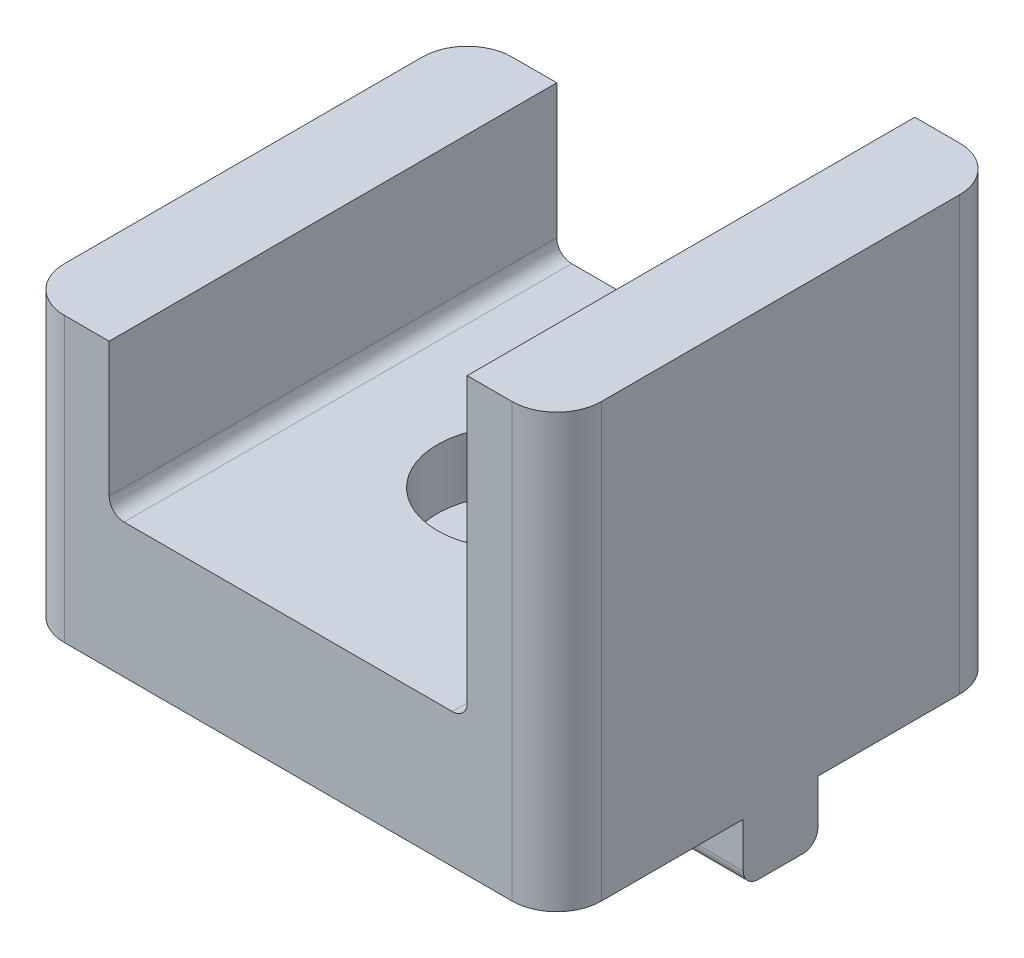
ISO-10303-21;
HEADER;
FILE_DESCRIPTION(('STEP AP214'),'2;1');
FILE_NAME('part.step','',(''),(''),'','','');
FILE_SCHEMA(('AUTOMOTIVE_DESIGN { 1 0 10303 214 1 1 1 1 }'));
ENDSEC;
DATA;
#1=APPLICATION_CONTEXT('core data for automotive mechanical design processes');
#2=APPLICATION_PROTOCOL_DEFINITION('international standard','automotive_design',2000,#1);
#3=PRODUCT_CONTEXT('',#1,'mechanical');
#4=PRODUCT('Part','Part','',(#3));
#5=PRODUCT_RELATED_PRODUCT_CATEGORY('part','',(#4));
#6=PRODUCT_DEFINITION_FORMATION('','',#4);
#7=PRODUCT_DEFINITION_CONTEXT('part definition',#1,'design');
#8=PRODUCT_DEFINITION('design','',#6,#7);
#9=PRODUCT_DEFINITION_SHAPE('','',#8);
#10=(LENGTH_UNIT() NAMED_UNIT(*) SI_UNIT(.MILLI.,.METRE.));
#11=(NAMED_UNIT(*) PLANE_ANGLE_UNIT() SI_UNIT($,.RADIAN.));
#12=(NAMED_UNIT(*) SI_UNIT($,.STERADIAN.) SOLID_ANGLE_UNIT());
#13=UNCERTAINTY_MEASURE_WITH_UNIT(LENGTH_MEASURE(1.E-05),#10,'distance_accuracy_value','');
#14=(GEOMETRIC_REPRESENTATION_CONTEXT(3) GLOBAL_UNCERTAINTY_ASSIGNED_CONTEXT((#13)) GLOBAL_UNIT_ASSIGNED_CONTEXT((#10,
#11,#12)) REPRESENTATION_CONTEXT('',''));
#15=CARTESIAN_POINT('',(0.,0.,0.));
#16=DIRECTION('',(0.,0.,1.));
#17=DIRECTION('',(1.,0.,0.));
#18=AXIS2_PLACEMENT_3D('',#15,#16,#17);
#19=CARTESIAN_POINT('',(0.,-4.5,30.));
#20=DIRECTION('',(0.,-1.,0.));
#21=DIRECTION('',(1.,0.,0.));
#22=AXIS2_PLACEMENT_3D('',#19,#20,#21);
#23=PLANE('',#22);
#24=CARTESIAN_POINT('',(0.,-4.5,15.));
#25=DIRECTION('',(0.,-1.,0.));
#26=DIRECTION('',(1.,0.,0.));
#27=AXIS2_PLACEMENT_3D('',#24,#25,#26);
#28=CIRCLE('',#27,2.5);
#29=CARTESIAN_POINT('',(2.5,-4.49999999999999,15.));
#30=VERTEX_POINT('',#29);
#31=EDGE_CURVE('E304',#30,#30,#28,.T.);
#32=ORIENTED_EDGE('',*,*,#31,.F.);
#33=EDGE_LOOP('',(#32));
#34=FACE_BOUND('',#33,.T.);
#35=DIRECTION('',(0.,0.,-1.));
#36=VECTOR('',#35,1.);
#37=CARTESIAN_POINT('',(10.,-4.49999999999999,17.5));
#38=LINE('',#37,#36);
#39=CARTESIAN_POINT('',(10.,-4.49999999999999,17.5));
#40=VERTEX_POINT('',#39);
#41=CARTESIAN_POINT('',(10.,-4.49999999999999,12.5));
#42=VERTEX_POINT('',#41);
#43=EDGE_CURVE('E228',#40,#42,#38,.T.);
#44=ORIENTED_EDGE('',*,*,#43,.F.);
#45=DIRECTION('',(-1.,0.,0.));
#46=VECTOR('',#45,1.);
#47=CARTESIAN_POINT('',(18.,-4.49999999999999,17.5));
#48=LINE('',#47,#46);
#49=CARTESIAN_POINT('',(18.,-4.49999999999999,17.5));
#50=VERTEX_POINT('',#49);
#51=EDGE_CURVE('E212',#50,#40,#48,.T.);
#52=ORIENTED_EDGE('',*,*,#51,.F.);
#53=DIRECTION('',(0.,0.,-1.));
#54=VECTOR('',#53,1.);
#55=CARTESIAN_POINT('',(18.,-4.5,30.));
#56=LINE('',#55,#54);
#57=CARTESIAN_POINT('',(18.,-4.5,27.));
#58=VERTEX_POINT('',#57);
#59=EDGE_CURVE('E224',#58,#50,#56,.T.);
#60=ORIENTED_EDGE('',*,*,#59,.F.);
#61=CARTESIAN_POINT('',(15.,-4.49999999999999,27.));
#62=DIRECTION('',(0.,-1.,0.));
#63=DIRECTION('',(1.,0.,0.));
#64=AXIS2_PLACEMENT_3D('',#61,#62,#63);
#65=CIRCLE('',#64,3.);
#66=CARTESIAN_POINT('',(15.,-4.49999999999999,30.));
#67=VERTEX_POINT('',#66);
#68=EDGE_CURVE('E280',#58,#67,#65,.T.);
#69=ORIENTED_EDGE('',*,*,#68,.T.);
#70=DIRECTION('',(-1.,0.,0.));
#71=VECTOR('',#70,1.);
#72=CARTESIAN_POINT('',(0.,-4.5,30.));
#73=LINE('',#72,#71);
#74=CARTESIAN_POINT('',(-15.,-4.5,30.));
#75=VERTEX_POINT('',#74);
#76=EDGE_CURVE('E373',#67,#75,#73,.T.);
#77=ORIENTED_EDGE('',*,*,#76,.T.);
#78=CARTESIAN_POINT('',(-15.,-4.5,27.));
#79=DIRECTION('',(0.,-1.,0.));
#80=DIRECTION('',(1.,0.,0.));
#81=AXIS2_PLACEMENT_3D('',#78,#79,#80);
#82=CIRCLE('',#81,3.);
#83=CARTESIAN_POINT('',(-18.,-4.5,27.));
#84=VERTEX_POINT('',#83);
#85=EDGE_CURVE('E276',#75,#84,#82,.T.);
#86=ORIENTED_EDGE('',*,*,#85,.T.);
#87=DIRECTION('',(0.,0.,-1.));
#88=VECTOR('',#87,1.);
#89=CARTESIAN_POINT('',(-18.,-4.5,30.));
#90=LINE('',#89,#88);
#91=CARTESIAN_POINT('',(-18.,-4.5,17.5));
#92=VERTEX_POINT('',#91);
#93=EDGE_CURVE('E238',#84,#92,#90,.T.);
#94=ORIENTED_EDGE('',*,*,#93,.T.);
#95=DIRECTION('',(-1.,0.,0.));
#96=VECTOR('',#95,1.);
#97=CARTESIAN_POINT('',(-18.,-4.5,17.5));
#98=LINE('',#97,#96);
#99=CARTESIAN_POINT('',(-10.,-4.5,17.5));
#100=VERTEX_POINT('',#99);
#101=EDGE_CURVE('E347',#100,#92,#98,.T.);
#102=ORIENTED_EDGE('',*,*,#101,.F.);
#103=DIRECTION('',(0.,0.,1.));
#104=VECTOR('',#103,1.);
#105=CARTESIAN_POINT('',(-10.,-4.5,17.5));
#106=LINE('',#105,#104);
#107=CARTESIAN_POINT('',(-10.,-4.5,12.5));
#108=VERTEX_POINT('',#107);
#109=EDGE_CURVE('E441',#108,#100,#106,.T.);
#110=ORIENTED_EDGE('',*,*,#109,.F.);
#111=DIRECTION('',(1.,0.,0.));
#112=VECTOR('',#111,1.);
#113=CARTESIAN_POINT('',(-18.,-4.5,12.5));
#114=LINE('',#113,#112);
#115=CARTESIAN_POINT('',(-18.,-4.5,12.5));
#116=VERTEX_POINT('',#115);
#117=EDGE_CURVE('E219',#116,#108,#114,.T.);
#118=ORIENTED_EDGE('',*,*,#117,.F.);
#119=CARTESIAN_POINT('',(-18.,-4.5,3.));
#120=VERTEX_POINT('',#119);
#121=EDGE_CURVE('E235',#116,#120,#90,.T.);
#122=ORIENTED_EDGE('',*,*,#121,.T.);
#123=CARTESIAN_POINT('',(-15.,-4.5,3.));
#124=DIRECTION('',(0.,-1.,0.));
#125=DIRECTION('',(1.,0.,0.));
#126=AXIS2_PLACEMENT_3D('',#123,#124,#125);
#127=CIRCLE('',#126,3.);
#128=CARTESIAN_POINT('',(-15.,-4.5,0.));
#129=VERTEX_POINT('',#128);
#130=EDGE_CURVE('E278',#120,#129,#127,.T.);
#131=ORIENTED_EDGE('',*,*,#130,.T.);
#132=DIRECTION('',(-1.,0.,0.));
#133=VECTOR('',#132,1.);
#134=CARTESIAN_POINT('',(0.,-4.5,0.));
#135=LINE('',#134,#133);
#136=CARTESIAN_POINT('',(15.,-4.49999999999999,0.));
#137=VERTEX_POINT('',#136);
#138=EDGE_CURVE('E372',#137,#129,#135,.T.);
#139=ORIENTED_EDGE('',*,*,#138,.F.);
#140=CARTESIAN_POINT('',(15.,-4.49999999999999,3.));
#141=DIRECTION('',(0.,-1.,0.));
#142=DIRECTION('',(1.,0.,0.));
#143=AXIS2_PLACEMENT_3D('',#140,#141,#142);
#144=CIRCLE('',#143,3.);
#145=CARTESIAN_POINT('',(18.,-4.5,3.));
#146=VERTEX_POINT('',#145);
#147=EDGE_CURVE('E282',#137,#146,#144,.T.);
#148=ORIENTED_EDGE('',*,*,#147,.T.);
#149=CARTESIAN_POINT('',(18.,-4.5,12.5));
#150=VERTEX_POINT('',#149);
#151=EDGE_CURVE('E236',#150,#146,#56,.T.);
#152=ORIENTED_EDGE('',*,*,#151,.F.);
#153=DIRECTION('',(1.,0.,0.));
#154=VECTOR('',#153,1.);
#155=CARTESIAN_POINT('',(18.,-4.49999999999999,12.5));
#156=LINE('',#155,#154);
#157=EDGE_CURVE('E450',#42,#150,#156,.T.);
#158=ORIENTED_EDGE('',*,*,#157,.F.);
#159=EDGE_LOOP('',(#44,#52,#60,#69,#77,#86,#94,#102,#110,#118,#122,#131,#139,#148,#152,#158));
#160=FACE_BOUND('',#159,.T.);
#161=ADVANCED_FACE('F35',(#34,#160),#23,.T.);
#162=CARTESIAN_POINT('',(0.,-5.5,15.));
#163=DIRECTION('',(0.,1.,0.));
#164=DIRECTION('',(0.,0.,1.));
#165=AXIS2_PLACEMENT_3D('',#162,#163,#164);
#166=CYLINDRICAL_SURFACE('',#165,2.5);
#167=ORIENTED_EDGE('',*,*,#31,.T.);
#168=EDGE_LOOP('',(#167));
#169=FACE_BOUND('',#168,.T.);
#170=CARTESIAN_POINT('',(0.,0.5,15.));
#171=DIRECTION('',(0.,1.,0.));
#172=DIRECTION('',(0.,0.,1.));
#173=AXIS2_PLACEMENT_3D('',#170,#171,#172);
#174=CIRCLE('',#173,2.5);
#175=CARTESIAN_POINT('',(0.,0.5,17.5));
#176=VERTEX_POINT('',#175);
#177=EDGE_CURVE('E301',#176,#176,#174,.F.);
#178=ORIENTED_EDGE('',*,*,#177,.F.);
#179=EDGE_LOOP('',(#178));
#180=FACE_BOUND('',#179,.T.);
#181=ADVANCED_FACE('F524',(#169,#180),#166,.F.);
#182=CARTESIAN_POINT('',(-18.,0.,30.));
#183=DIRECTION('',(-1.,0.,0.));
#184=DIRECTION('',(0.,-1.,0.));
#185=AXIS2_PLACEMENT_3D('',#182,#183,#184);
#186=PLANE('',#185);
#187=DIRECTION('',(0.,1.,0.));
#188=VECTOR('',#187,1.);
#189=CARTESIAN_POINT('',(-18.,-8.5,12.5));
#190=LINE('',#189,#188);
#191=CARTESIAN_POINT('',(-18.,-7.5,12.5));
#192=VERTEX_POINT('',#191);
#193=EDGE_CURVE('E338',#192,#116,#190,.T.);
#194=ORIENTED_EDGE('',*,*,#193,.F.);
#195=CARTESIAN_POINT('',(-18.,-7.5,13.5));
#196=DIRECTION('',(-1.,0.,0.));
#197=DIRECTION('',(0.,-1.,0.));
#198=AXIS2_PLACEMENT_3D('',#195,#196,#197);
#199=CIRCLE('',#198,1.);
#200=CARTESIAN_POINT('',(-18.,-8.5,13.5));
#201=VERTEX_POINT('',#200);
#202=EDGE_CURVE('E43',#192,#201,#199,.T.);
#203=ORIENTED_EDGE('',*,*,#202,.T.);
#204=DIRECTION('',(0.,0.,-1.));
#205=VECTOR('',#204,1.);
#206=CARTESIAN_POINT('',(-18.,-8.5,17.5));
#207=LINE('',#206,#205);
#208=CARTESIAN_POINT('',(-18.,-8.5,16.5));
#209=VERTEX_POINT('',#208);
#210=EDGE_CURVE('E336',#209,#201,#207,.T.);
#211=ORIENTED_EDGE('',*,*,#210,.F.);
#212=CARTESIAN_POINT('',(-18.,-7.5,16.5));
#213=DIRECTION('',(-1.,0.,0.));
#214=DIRECTION('',(0.,-1.,0.));
#215=AXIS2_PLACEMENT_3D('',#212,#213,#214);
#216=CIRCLE('',#215,1.);
#217=CARTESIAN_POINT('',(-18.,-7.5,17.5));
#218=VERTEX_POINT('',#217);
#219=EDGE_CURVE('E50',#209,#218,#216,.T.);
#220=ORIENTED_EDGE('',*,*,#219,.T.);
#221=DIRECTION('',(0.,1.,0.));
#222=VECTOR('',#221,1.);
#223=CARTESIAN_POINT('',(-18.,-8.5,17.5));
#224=LINE('',#223,#222);
#225=EDGE_CURVE('E362',#218,#92,#224,.T.);
#226=ORIENTED_EDGE('',*,*,#225,.T.);
#227=ORIENTED_EDGE('',*,*,#93,.F.);
#228=DIRECTION('',(0.,1.,0.));
#229=VECTOR('',#228,1.);
#230=CARTESIAN_POINT('',(-18.,0.,27.));
#231=LINE('',#230,#229);
#232=CARTESIAN_POINT('',(-18.,14.5,27.));
#233=VERTEX_POINT('',#232);
#234=EDGE_CURVE('E294',#84,#233,#231,.T.);
#235=ORIENTED_EDGE('',*,*,#234,.T.);
#236=DIRECTION('',(0.,0.,-1.));
#237=VECTOR('',#236,1.);
#238=CARTESIAN_POINT('',(-18.,14.5,30.));
#239=LINE('',#238,#237);
#240=CARTESIAN_POINT('',(-18.,14.5,3.));
#241=VERTEX_POINT('',#240);
#242=EDGE_CURVE('E390',#233,#241,#239,.T.);
#243=ORIENTED_EDGE('',*,*,#242,.T.);
#244=DIRECTION('',(0.,1.,0.));
#245=VECTOR('',#244,1.);
#246=CARTESIAN_POINT('',(-18.,-4.5,3.));
#247=LINE('',#246,#245);
#248=EDGE_CURVE('E297',#241,#120,#247,.F.);
#249=ORIENTED_EDGE('',*,*,#248,.T.);
#250=ORIENTED_EDGE('',*,*,#121,.F.);
#251=EDGE_LOOP('',(#194,#203,#211,#220,#226,#227,#235,#243,#249,#250));
#252=FACE_BOUND('',#251,.T.);
#253=ADVANCED_FACE('F335',(#252),#186,.T.);
#254=CARTESIAN_POINT('',(18.,0.,30.));
#255=DIRECTION('',(-1.,0.,0.));
#256=DIRECTION('',(0.,0.,1.));
#257=AXIS2_PLACEMENT_3D('',#254,#255,#256);
#258=PLANE('',#257);
#259=DIRECTION('',(0.,0.,1.));
#260=VECTOR('',#259,1.);
#261=CARTESIAN_POINT('',(18.,-8.49999999999999,17.5));
#262=LINE('',#261,#260);
#263=CARTESIAN_POINT('',(18.,-8.49999999999999,13.5));
#264=VERTEX_POINT('',#263);
#265=CARTESIAN_POINT('',(18.,-8.49999999999999,16.5));
#266=VERTEX_POINT('',#265);
#267=EDGE_CURVE('E453',#264,#266,#262,.T.);
#268=ORIENTED_EDGE('',*,*,#267,.F.);
#269=CARTESIAN_POINT('',(18.,-7.49999999999999,13.5));
#270=DIRECTION('',(-1.,0.,0.));
#271=DIRECTION('',(0.,0.,1.));
#272=AXIS2_PLACEMENT_3D('',#269,#270,#271);
#273=CIRCLE('',#272,1.);
#274=CARTESIAN_POINT('',(18.,-7.49999999999999,12.5));
#275=VERTEX_POINT('',#274);
#276=EDGE_CURVE('E313',#264,#275,#273,.F.);
#277=ORIENTED_EDGE('',*,*,#276,.T.);
#278=DIRECTION('',(0.,1.,0.));
#279=VECTOR('',#278,1.);
#280=CARTESIAN_POINT('',(18.,-8.49999999999999,12.5));
#281=LINE('',#280,#279);
#282=EDGE_CURVE('E447',#275,#150,#281,.T.);
#283=ORIENTED_EDGE('',*,*,#282,.T.);
#284=ORIENTED_EDGE('',*,*,#151,.T.);
#285=DIRECTION('',(0.,1.,0.));
#286=VECTOR('',#285,1.);
#287=CARTESIAN_POINT('',(18.,0.,3.));
#288=LINE('',#287,#286);
#289=CARTESIAN_POINT('',(18.,24.5,3.));
#290=VERTEX_POINT('',#289);
#291=EDGE_CURVE('E264',#146,#290,#288,.T.);
#292=ORIENTED_EDGE('',*,*,#291,.T.);
#293=DIRECTION('',(0.,0.,-1.));
#294=VECTOR('',#293,1.);
#295=CARTESIAN_POINT('',(18.,24.5,30.));
#296=LINE('',#295,#294);
#297=CARTESIAN_POINT('',(18.,24.5,27.));
#298=VERTEX_POINT('',#297);
#299=EDGE_CURVE('E240',#298,#290,#296,.T.);
#300=ORIENTED_EDGE('',*,*,#299,.F.);
#301=DIRECTION('',(0.,1.,0.));
#302=VECTOR('',#301,1.);
#303=CARTESIAN_POINT('',(18.,-4.5,27.));
#304=LINE('',#303,#302);
#305=EDGE_CURVE('E234',#298,#58,#304,.F.);
#306=ORIENTED_EDGE('',*,*,#305,.T.);
#307=ORIENTED_EDGE('',*,*,#59,.T.);
#308=DIRECTION('',(0.,1.,0.));
#309=VECTOR('',#308,1.);
#310=CARTESIAN_POINT('',(18.,-8.49999999999999,17.5));
#311=LINE('',#310,#309);
#312=CARTESIAN_POINT('',(18.,-7.49999999999999,17.5));
#313=VERTEX_POINT('',#312);
#314=EDGE_CURVE('E208',#313,#50,#311,.T.);
#315=ORIENTED_EDGE('',*,*,#314,.F.);
#316=CARTESIAN_POINT('',(18.,-7.49999999999999,16.5));
#317=DIRECTION('',(-1.,0.,0.));
#318=DIRECTION('',(0.,0.,1.));
#319=AXIS2_PLACEMENT_3D('',#316,#317,#318);
#320=CIRCLE('',#319,1.);
#321=EDGE_CURVE('E311',#313,#266,#320,.F.);
#322=ORIENTED_EDGE('',*,*,#321,.T.);
#323=EDGE_LOOP('',(#268,#277,#283,#284,#292,#300,#306,#307,#315,#322));
#324=FACE_BOUND('',#323,.T.);
#325=ADVANCED_FACE('F231',(#324),#258,.F.);
#326=CARTESIAN_POINT('',(0.,24.5,30.));
#327=DIRECTION('',(0.,1.,0.));
#328=DIRECTION('',(0.,0.,1.));
#329=AXIS2_PLACEMENT_3D('',#326,#327,#328);
#330=PLANE('',#329);
#331=ORIENTED_EDGE('',*,*,#299,.T.);
#332=CARTESIAN_POINT('',(15.,24.5,3.));
#333=DIRECTION('',(0.,1.,0.));
#334=DIRECTION('',(0.,0.,1.));
#335=AXIS2_PLACEMENT_3D('',#332,#333,#334);
#336=CIRCLE('',#335,3.);
#337=CARTESIAN_POINT('',(15.,24.5,0.));
#338=VERTEX_POINT('',#337);
#339=EDGE_CURVE('E269',#290,#338,#336,.T.);
#340=ORIENTED_EDGE('',*,*,#339,.T.);
#341=DIRECTION('',(1.,0.,0.));
#342=VECTOR('',#341,1.);
#343=CARTESIAN_POINT('',(0.,24.5,0.));
#344=LINE('',#343,#342);
#345=CARTESIAN_POINT('',(12.,24.5,0.));
#346=VERTEX_POINT('',#345);
#347=EDGE_CURVE('E393',#346,#338,#344,.T.);
#348=ORIENTED_EDGE('',*,*,#347,.F.);
#349=DIRECTION('',(0.,0.,-1.));
#350=VECTOR('',#349,1.);
#351=CARTESIAN_POINT('',(12.,24.5,30.));
#352=LINE('',#351,#350);
#353=CARTESIAN_POINT('',(12.,24.5,30.));
#354=VERTEX_POINT('',#353);
#355=EDGE_CURVE('E409',#354,#346,#352,.T.);
#356=ORIENTED_EDGE('',*,*,#355,.F.);
#357=DIRECTION('',(1.,0.,0.));
#358=VECTOR('',#357,1.);
#359=CARTESIAN_POINT('',(0.,24.5,30.));
#360=LINE('',#359,#358);
#361=CARTESIAN_POINT('',(15.,24.5,30.));
#362=VERTEX_POINT('',#361);
#363=EDGE_CURVE('E376',#354,#362,#360,.T.);
#364=ORIENTED_EDGE('',*,*,#363,.T.);
#365=CARTESIAN_POINT('',(15.,24.5,27.));
#366=DIRECTION('',(0.,1.,0.));
#367=DIRECTION('',(0.,0.,1.));
#368=AXIS2_PLACEMENT_3D('',#365,#366,#367);
#369=CIRCLE('',#368,3.);
#370=EDGE_CURVE('E267',#362,#298,#369,.T.);
#371=ORIENTED_EDGE('',*,*,#370,.T.);
#372=EDGE_LOOP('',(#331,#340,#348,#356,#364,#371));
#373=FACE_BOUND('',#372,.T.);
#374=ADVANCED_FACE('F417',(#373),#330,.T.);
#375=CARTESIAN_POINT('',(12.,0.,30.));
#376=DIRECTION('',(-1.,0.,0.));
#377=DIRECTION('',(0.,0.,1.));
#378=AXIS2_PLACEMENT_3D('',#375,#376,#377);
#379=PLANE('',#378);
#380=DIRECTION('',(0.,1.,0.));
#381=VECTOR('',#380,1.);
#382=CARTESIAN_POINT('',(12.,0.,0.));
#383=LINE('',#382,#381);
#384=CARTESIAN_POINT('',(12.,5.5,0.));
#385=VERTEX_POINT('',#384);
#386=EDGE_CURVE('E396',#385,#346,#383,.T.);
#387=ORIENTED_EDGE('',*,*,#386,.F.);
#388=DIRECTION('',(0.,0.,-1.));
#389=VECTOR('',#388,1.);
#390=CARTESIAN_POINT('',(12.,5.5,30.));
#391=LINE('',#390,#389);
#392=CARTESIAN_POINT('',(12.,5.5,30.));
#393=VERTEX_POINT('',#392);
#394=EDGE_CURVE('E250',#385,#393,#391,.F.);
#395=ORIENTED_EDGE('',*,*,#394,.T.);
#396=DIRECTION('',(0.,1.,0.));
#397=VECTOR('',#396,1.);
#398=CARTESIAN_POINT('',(12.,0.,30.));
#399=LINE('',#398,#397);
#400=EDGE_CURVE('E380',#393,#354,#399,.T.);
#401=ORIENTED_EDGE('',*,*,#400,.T.);
#402=ORIENTED_EDGE('',*,*,#355,.T.);
#403=EDGE_LOOP('',(#387,#395,#401,#402));
#404=FACE_BOUND('',#403,.T.);
#405=ADVANCED_FACE('F683',(#404),#379,.T.);
#406=CARTESIAN_POINT('',(0.,4.5,30.));
#407=DIRECTION('',(0.,-1.,0.));
#408=DIRECTION('',(0.,0.,-1.));
#409=AXIS2_PLACEMENT_3D('',#406,#407,#408);
#410=PLANE('',#409);
#411=CARTESIAN_POINT('',(0.,4.5,15.));
#412=DIRECTION('',(0.,1.,0.));
#413=DIRECTION('',(0.,0.,1.));
#414=AXIS2_PLACEMENT_3D('',#411,#412,#413);
#415=CIRCLE('',#414,5.);
#416=CARTESIAN_POINT('',(0.,4.5,20.));
#417=VERTEX_POINT('',#416);
#418=EDGE_CURVE('E360',#417,#417,#415,.T.);
#419=ORIENTED_EDGE('',*,*,#418,.F.);
#420=EDGE_LOOP('',(#419));
#421=FACE_BOUND('',#420,.T.);
#422=DIRECTION('',(-1.,0.,0.));
#423=VECTOR('',#422,1.);
#424=CARTESIAN_POINT('',(0.,4.5,30.));
#425=LINE('',#424,#423);
#426=CARTESIAN_POINT('',(11.,4.5,30.));
#427=VERTEX_POINT('',#426);
#428=CARTESIAN_POINT('',(-11.,4.5,30.));
#429=VERTEX_POINT('',#428);
#430=EDGE_CURVE('E382',#427,#429,#425,.T.);
#431=ORIENTED_EDGE('',*,*,#430,.F.);
#432=DIRECTION('',(0.,0.,-1.));
#433=VECTOR('',#432,1.);
#434=CARTESIAN_POINT('',(11.,4.5,30.));
#435=LINE('',#434,#433);
#436=CARTESIAN_POINT('',(11.,4.5,0.));
#437=VERTEX_POINT('',#436);
#438=EDGE_CURVE('E247',#427,#437,#435,.T.);
#439=ORIENTED_EDGE('',*,*,#438,.T.);
#440=DIRECTION('',(-1.,0.,0.));
#441=VECTOR('',#440,1.);
#442=CARTESIAN_POINT('',(0.,4.5,0.));
#443=LINE('',#442,#441);
#444=CARTESIAN_POINT('',(-11.,4.5,0.));
#445=VERTEX_POINT('',#444);
#446=EDGE_CURVE('E398',#437,#445,#443,.T.);
#447=ORIENTED_EDGE('',*,*,#446,.T.);
#448=DIRECTION('',(0.,0.,-1.));
#449=VECTOR('',#448,1.);
#450=CARTESIAN_POINT('',(-11.,4.5,30.));
#451=LINE('',#450,#449);
#452=EDGE_CURVE('E245',#445,#429,#451,.F.);
#453=ORIENTED_EDGE('',*,*,#452,.T.);
#454=EDGE_LOOP('',(#431,#439,#447,#453));
#455=FACE_BOUND('',#454,.T.);
#456=ADVANCED_FACE('F493',(#421,#455),#410,.F.);
#457=CARTESIAN_POINT('',(-12.,0.,30.));
#458=DIRECTION('',(-1.,0.,0.));
#459=DIRECTION('',(0.,0.,1.));
#460=AXIS2_PLACEMENT_3D('',#457,#458,#459);
#461=PLANE('',#460);
#462=DIRECTION('',(0.,1.,0.));
#463=VECTOR('',#462,1.);
#464=CARTESIAN_POINT('',(-12.,0.,30.));
#465=LINE('',#464,#463);
#466=CARTESIAN_POINT('',(-12.,5.5,30.));
#467=VERTEX_POINT('',#466);
#468=CARTESIAN_POINT('',(-12.,14.5,30.));
#469=VERTEX_POINT('',#468);
#470=EDGE_CURVE('E385',#467,#469,#465,.T.);
#471=ORIENTED_EDGE('',*,*,#470,.F.);
#472=DIRECTION('',(0.,0.,-1.));
#473=VECTOR('',#472,1.);
#474=CARTESIAN_POINT('',(-12.,5.5,0.));
#475=LINE('',#474,#473);
#476=CARTESIAN_POINT('',(-12.,5.5,0.));
#477=VERTEX_POINT('',#476);
#478=EDGE_CURVE('E252',#467,#477,#475,.T.);
#479=ORIENTED_EDGE('',*,*,#478,.T.);
#480=DIRECTION('',(0.,1.,0.));
#481=VECTOR('',#480,1.);
#482=CARTESIAN_POINT('',(-12.,0.,0.));
#483=LINE('',#482,#481);
#484=CARTESIAN_POINT('',(-12.,14.5,0.));
#485=VERTEX_POINT('',#484);
#486=EDGE_CURVE('E401',#477,#485,#483,.T.);
#487=ORIENTED_EDGE('',*,*,#486,.T.);
#488=DIRECTION('',(0.,0.,-1.));
#489=VECTOR('',#488,1.);
#490=CARTESIAN_POINT('',(-12.,14.5,30.));
#491=LINE('',#490,#489);
#492=EDGE_CURVE('E407',#469,#485,#491,.T.);
#493=ORIENTED_EDGE('',*,*,#492,.F.);
#494=EDGE_LOOP('',(#471,#479,#487,#493));
#495=FACE_BOUND('',#494,.T.);
#496=ADVANCED_FACE('F503',(#495),#461,.F.);
#497=CARTESIAN_POINT('',(0.,14.5,30.));
#498=DIRECTION('',(0.,-1.,0.));
#499=DIRECTION('',(0.,0.,-1.));
#500=AXIS2_PLACEMENT_3D('',#497,#498,#499);
#501=PLANE('',#500);
#502=DIRECTION('',(-1.,0.,0.));
#503=VECTOR('',#502,1.);
#504=CARTESIAN_POINT('',(0.,14.5,0.));
#505=LINE('',#504,#503);
#506=CARTESIAN_POINT('',(-15.,14.5,0.));
#507=VERTEX_POINT('',#506);
#508=EDGE_CURVE('E377',#485,#507,#505,.T.);
#509=ORIENTED_EDGE('',*,*,#508,.T.);
#510=CARTESIAN_POINT('',(-15.,14.5,3.));
#511=DIRECTION('',(0.,-1.,0.));
#512=DIRECTION('',(0.,0.,-1.));
#513=AXIS2_PLACEMENT_3D('',#510,#511,#512);
#514=CIRCLE('',#513,3.);
#515=EDGE_CURVE('E292',#507,#241,#514,.F.);
#516=ORIENTED_EDGE('',*,*,#515,.T.);
#517=ORIENTED_EDGE('',*,*,#242,.F.);
#518=CARTESIAN_POINT('',(-15.,14.5,27.));
#519=DIRECTION('',(0.,-1.,0.));
#520=DIRECTION('',(0.,0.,-1.));
#521=AXIS2_PLACEMENT_3D('',#518,#519,#520);
#522=CIRCLE('',#521,3.);
#523=CARTESIAN_POINT('',(-15.,14.5,30.));
#524=VERTEX_POINT('',#523);
#525=EDGE_CURVE('E290',#233,#524,#522,.F.);
#526=ORIENTED_EDGE('',*,*,#525,.T.);
#527=DIRECTION('',(-1.,0.,0.));
#528=VECTOR('',#527,1.);
#529=CARTESIAN_POINT('',(0.,14.5,30.));
#530=LINE('',#529,#528);
#531=EDGE_CURVE('E387',#469,#524,#530,.T.);
#532=ORIENTED_EDGE('',*,*,#531,.F.);
#533=ORIENTED_EDGE('',*,*,#492,.T.);
#534=EDGE_LOOP('',(#509,#516,#517,#526,#532,#533));
#535=FACE_BOUND('',#534,.T.);
#536=ADVANCED_FACE('F506',(#535),#501,.F.);
#537=CARTESIAN_POINT('',(0.,0.,30.));
#538=DIRECTION('',(0.,0.,1.));
#539=DIRECTION('',(1.,0.,0.));
#540=AXIS2_PLACEMENT_3D('',#537,#538,#539);
#541=PLANE('',#540);
#542=ORIENTED_EDGE('',*,*,#76,.F.);
#543=DIRECTION('',(0.,1.,0.));
#544=VECTOR('',#543,1.);
#545=CARTESIAN_POINT('',(15.,24.5,30.));
#546=LINE('',#545,#544);
#547=EDGE_CURVE('E287',#67,#362,#546,.T.);
#548=ORIENTED_EDGE('',*,*,#547,.T.);
#549=ORIENTED_EDGE('',*,*,#363,.F.);
#550=ORIENTED_EDGE('',*,*,#400,.F.);
#551=CARTESIAN_POINT('',(11.,5.5,30.));
#552=DIRECTION('',(0.,0.,1.));
#553=DIRECTION('',(1.,0.,0.));
#554=AXIS2_PLACEMENT_3D('',#551,#552,#553);
#555=CIRCLE('',#554,1.);
#556=EDGE_CURVE('E257',#393,#427,#555,.F.);
#557=ORIENTED_EDGE('',*,*,#556,.T.);
#558=ORIENTED_EDGE('',*,*,#430,.T.);
#559=CARTESIAN_POINT('',(-11.,5.5,30.));
#560=DIRECTION('',(0.,0.,1.));
#561=DIRECTION('',(1.,0.,0.));
#562=AXIS2_PLACEMENT_3D('',#559,#560,#561);
#563=CIRCLE('',#562,1.);
#564=EDGE_CURVE('E261',#429,#467,#563,.F.);
#565=ORIENTED_EDGE('',*,*,#564,.T.);
#566=ORIENTED_EDGE('',*,*,#470,.T.);
#567=ORIENTED_EDGE('',*,*,#531,.T.);
#568=DIRECTION('',(0.,1.,0.));
#569=VECTOR('',#568,1.);
#570=CARTESIAN_POINT('',(-15.,0.,30.));
#571=LINE('',#570,#569);
#572=EDGE_CURVE('E285',#524,#75,#571,.F.);
#573=ORIENTED_EDGE('',*,*,#572,.T.);
#574=EDGE_LOOP('',(#542,#548,#549,#550,#557,#558,#565,#566,#567,#573));
#575=FACE_BOUND('',#574,.T.);
#576=ADVANCED_FACE('F425',(#575),#541,.T.);
#577=CARTESIAN_POINT('',(0.,0.,0.));
#578=DIRECTION('',(0.,0.,1.));
#579=DIRECTION('',(1.,0.,0.));
#580=AXIS2_PLACEMENT_3D('',#577,#578,#579);
#581=PLANE('',#580);
#582=ORIENTED_EDGE('',*,*,#347,.T.);
#583=DIRECTION('',(0.,1.,0.));
#584=VECTOR('',#583,1.);
#585=CARTESIAN_POINT('',(15.,0.,0.));
#586=LINE('',#585,#584);
#587=EDGE_CURVE('E274',#338,#137,#586,.F.);
#588=ORIENTED_EDGE('',*,*,#587,.T.);
#589=ORIENTED_EDGE('',*,*,#138,.T.);
#590=DIRECTION('',(0.,1.,0.));
#591=VECTOR('',#590,1.);
#592=CARTESIAN_POINT('',(-15.,14.5,0.));
#593=LINE('',#592,#591);
#594=EDGE_CURVE('E271',#129,#507,#593,.T.);
#595=ORIENTED_EDGE('',*,*,#594,.T.);
#596=ORIENTED_EDGE('',*,*,#508,.F.);
#597=ORIENTED_EDGE('',*,*,#486,.F.);
#598=CARTESIAN_POINT('',(-11.,5.5,0.));
#599=DIRECTION('',(0.,0.,1.));
#600=DIRECTION('',(1.,0.,0.));
#601=AXIS2_PLACEMENT_3D('',#598,#599,#600);
#602=CIRCLE('',#601,1.);
#603=EDGE_CURVE('E259',#477,#445,#602,.T.);
#604=ORIENTED_EDGE('',*,*,#603,.T.);
#605=ORIENTED_EDGE('',*,*,#446,.F.);
#606=CARTESIAN_POINT('',(11.,5.5,0.));
#607=DIRECTION('',(0.,0.,1.));
#608=DIRECTION('',(1.,0.,0.));
#609=AXIS2_PLACEMENT_3D('',#606,#607,#608);
#610=CIRCLE('',#609,1.);
#611=EDGE_CURVE('E255',#437,#385,#610,.T.);
#612=ORIENTED_EDGE('',*,*,#611,.T.);
#613=ORIENTED_EDGE('',*,*,#386,.T.);
#614=EDGE_LOOP('',(#582,#588,#589,#595,#596,#597,#604,#605,#612,#613));
#615=FACE_BOUND('',#614,.T.);
#616=ADVANCED_FACE('F482',(#615),#581,.F.);
#617=CARTESIAN_POINT('',(11.,5.5,30.));
#618=DIRECTION('',(0.,0.,-1.));
#619=DIRECTION('',(-1.,0.,0.));
#620=AXIS2_PLACEMENT_3D('',#617,#618,#619);
#621=CYLINDRICAL_SURFACE('',#620,1.);
#622=ORIENTED_EDGE('',*,*,#556,.F.);
#623=ORIENTED_EDGE('',*,*,#394,.F.);
#624=ORIENTED_EDGE('',*,*,#611,.F.);
#625=ORIENTED_EDGE('',*,*,#438,.F.);
#626=EDGE_LOOP('',(#622,#623,#624,#625));
#627=FACE_BOUND('',#626,.T.);
#628=ADVANCED_FACE('F490',(#627),#621,.F.);
#629=CARTESIAN_POINT('',(-11.,5.5,30.));
#630=DIRECTION('',(0.,0.,1.));
#631=DIRECTION('',(1.,0.,0.));
#632=AXIS2_PLACEMENT_3D('',#629,#630,#631);
#633=CYLINDRICAL_SURFACE('',#632,1.);
#634=ORIENTED_EDGE('',*,*,#564,.F.);
#635=ORIENTED_EDGE('',*,*,#452,.F.);
#636=ORIENTED_EDGE('',*,*,#603,.F.);
#637=ORIENTED_EDGE('',*,*,#478,.F.);
#638=EDGE_LOOP('',(#634,#635,#636,#637));
#639=FACE_BOUND('',#638,.T.);
#640=ADVANCED_FACE('F500',(#639),#633,.F.);
#641=CARTESIAN_POINT('',(15.,0.,3.));
#642=DIRECTION('',(0.,1.,0.));
#643=DIRECTION('',(0.,0.,1.));
#644=AXIS2_PLACEMENT_3D('',#641,#642,#643);
#645=CYLINDRICAL_SURFACE('',#644,3.);
#646=ORIENTED_EDGE('',*,*,#147,.F.);
#647=ORIENTED_EDGE('',*,*,#587,.F.);
#648=ORIENTED_EDGE('',*,*,#339,.F.);
#649=ORIENTED_EDGE('',*,*,#291,.F.);
#650=EDGE_LOOP('',(#646,#647,#648,#649));
#651=FACE_BOUND('',#650,.T.);
#652=ADVANCED_FACE('F480',(#651),#645,.T.);
#653=CARTESIAN_POINT('',(15.,0.,27.));
#654=DIRECTION('',(0.,-1.,0.));
#655=DIRECTION('',(0.,0.,-1.));
#656=AXIS2_PLACEMENT_3D('',#653,#654,#655);
#657=CYLINDRICAL_SURFACE('',#656,3.);
#658=ORIENTED_EDGE('',*,*,#68,.F.);
#659=ORIENTED_EDGE('',*,*,#305,.F.);
#660=ORIENTED_EDGE('',*,*,#370,.F.);
#661=ORIENTED_EDGE('',*,*,#547,.F.);
#662=EDGE_LOOP('',(#658,#659,#660,#661));
#663=FACE_BOUND('',#662,.T.);
#664=ADVANCED_FACE('F420',(#663),#657,.T.);
#665=CARTESIAN_POINT('',(-15.,0.,3.));
#666=DIRECTION('',(0.,-1.,0.));
#667=DIRECTION('',(1.,0.,0.));
#668=AXIS2_PLACEMENT_3D('',#665,#666,#667);
#669=CYLINDRICAL_SURFACE('',#668,3.);
#670=ORIENTED_EDGE('',*,*,#130,.F.);
#671=ORIENTED_EDGE('',*,*,#248,.F.);
#672=ORIENTED_EDGE('',*,*,#515,.F.);
#673=ORIENTED_EDGE('',*,*,#594,.F.);
#674=EDGE_LOOP('',(#670,#671,#672,#673));
#675=FACE_BOUND('',#674,.T.);
#676=ADVANCED_FACE('F510',(#675),#669,.T.);
#677=CARTESIAN_POINT('',(-15.,0.,27.));
#678=DIRECTION('',(0.,1.,0.));
#679=DIRECTION('',(-1.,0.,0.));
#680=AXIS2_PLACEMENT_3D('',#677,#678,#679);
#681=CYLINDRICAL_SURFACE('',#680,3.);
#682=ORIENTED_EDGE('',*,*,#85,.F.);
#683=ORIENTED_EDGE('',*,*,#572,.F.);
#684=ORIENTED_EDGE('',*,*,#525,.F.);
#685=ORIENTED_EDGE('',*,*,#234,.F.);
#686=EDGE_LOOP('',(#682,#683,#684,#685));
#687=FACE_BOUND('',#686,.T.);
#688=ADVANCED_FACE('F430',(#687),#681,.T.);
#689=CARTESIAN_POINT('',(0.,0.5,15.));
#690=DIRECTION('',(0.,1.,0.));
#691=DIRECTION('',(0.,0.,1.));
#692=AXIS2_PLACEMENT_3D('',#689,#690,#691);
#693=PLANE('',#692);
#694=CARTESIAN_POINT('',(0.,0.5,15.));
#695=DIRECTION('',(0.,1.,0.));
#696=DIRECTION('',(0.,0.,1.));
#697=AXIS2_PLACEMENT_3D('',#694,#695,#696);
#698=CIRCLE('',#697,5.);
#699=CARTESIAN_POINT('',(0.,0.5,20.));
#700=VERTEX_POINT('',#699);
#701=EDGE_CURVE('E305',#700,#700,#698,.T.);
#702=ORIENTED_EDGE('',*,*,#701,.T.);
#703=EDGE_LOOP('',(#702));
#704=FACE_BOUND('',#703,.T.);
#705=ORIENTED_EDGE('',*,*,#177,.T.);
#706=EDGE_LOOP('',(#705));
#707=FACE_BOUND('',#706,.T.);
#708=ADVANCED_FACE('F550',(#704,#707),#693,.T.);
#709=CARTESIAN_POINT('',(0.,0.5,15.));
#710=DIRECTION('',(0.,1.,0.));
#711=DIRECTION('',(0.,0.,1.));
#712=AXIS2_PLACEMENT_3D('',#709,#710,#711);
#713=CYLINDRICAL_SURFACE('',#712,5.);
#714=ORIENTED_EDGE('',*,*,#701,.F.);
#715=EDGE_LOOP('',(#714));
#716=FACE_BOUND('',#715,.T.);
#717=ORIENTED_EDGE('',*,*,#418,.T.);
#718=EDGE_LOOP('',(#717));
#719=FACE_BOUND('',#718,.T.);
#720=ADVANCED_FACE('F633',(#716,#719),#713,.F.);
#721=CARTESIAN_POINT('',(-18.,-8.5,12.5));
#722=DIRECTION('',(0.,0.,1.));
#723=DIRECTION('',(1.,0.,0.));
#724=AXIS2_PLACEMENT_3D('',#721,#722,#723);
#725=PLANE('',#724);
#726=DIRECTION('',(0.,1.,0.));
#727=VECTOR('',#726,1.);
#728=CARTESIAN_POINT('',(-10.,-8.5,12.5));
#729=LINE('',#728,#727);
#730=CARTESIAN_POINT('',(-10.,-7.5,12.5));
#731=VERTEX_POINT('',#730);
#732=EDGE_CURVE('E353',#731,#108,#729,.T.);
#733=ORIENTED_EDGE('',*,*,#732,.F.);
#734=DIRECTION('',(1.,0.,0.));
#735=VECTOR('',#734,1.);
#736=CARTESIAN_POINT('',(-18.,-7.5,12.5));
#737=LINE('',#736,#735);
#738=EDGE_CURVE('E58',#731,#192,#737,.F.);
#739=ORIENTED_EDGE('',*,*,#738,.T.);
#740=ORIENTED_EDGE('',*,*,#193,.T.);
#741=ORIENTED_EDGE('',*,*,#117,.T.);
#742=EDGE_LOOP('',(#733,#739,#740,#741));
#743=FACE_BOUND('',#742,.T.);
#744=ADVANCED_FACE('F356',(#743),#725,.F.);
#745=CARTESIAN_POINT('',(-10.,-8.5,17.5));
#746=DIRECTION('',(-1.,0.,0.));
#747=DIRECTION('',(0.,-1.,0.));
#748=AXIS2_PLACEMENT_3D('',#745,#746,#747);
#749=PLANE('',#748);
#750=DIRECTION('',(0.,0.,1.));
#751=VECTOR('',#750,1.);
#752=CARTESIAN_POINT('',(-10.,-8.5,17.5));
#753=LINE('',#752,#751);
#754=CARTESIAN_POINT('',(-10.,-8.5,13.5));
#755=VERTEX_POINT('',#754);
#756=CARTESIAN_POINT('',(-10.,-8.5,16.5));
#757=VERTEX_POINT('',#756);
#758=EDGE_CURVE('E346',#755,#757,#753,.T.);
#759=ORIENTED_EDGE('',*,*,#758,.F.);
#760=CARTESIAN_POINT('',(-10.,-7.5,13.5));
#761=DIRECTION('',(-1.,0.,0.));
#762=DIRECTION('',(0.,-1.,0.));
#763=AXIS2_PLACEMENT_3D('',#760,#761,#762);
#764=CIRCLE('',#763,1.);
#765=EDGE_CURVE('E330',#755,#731,#764,.F.);
#766=ORIENTED_EDGE('',*,*,#765,.T.);
#767=ORIENTED_EDGE('',*,*,#732,.T.);
#768=ORIENTED_EDGE('',*,*,#109,.T.);
#769=DIRECTION('',(0.,1.,0.));
#770=VECTOR('',#769,1.);
#771=CARTESIAN_POINT('',(-10.,-8.5,17.5));
#772=LINE('',#771,#770);
#773=CARTESIAN_POINT('',(-10.,-7.5,17.5));
#774=VERTEX_POINT('',#773);
#775=EDGE_CURVE('E358',#774,#100,#772,.T.);
#776=ORIENTED_EDGE('',*,*,#775,.F.);
#777=CARTESIAN_POINT('',(-10.,-7.5,16.5));
#778=DIRECTION('',(-1.,0.,0.));
#779=DIRECTION('',(0.,-1.,0.));
#780=AXIS2_PLACEMENT_3D('',#777,#778,#779);
#781=CIRCLE('',#780,1.);
#782=EDGE_CURVE('E328',#774,#757,#781,.F.);
#783=ORIENTED_EDGE('',*,*,#782,.T.);
#784=EDGE_LOOP('',(#759,#766,#767,#768,#776,#783));
#785=FACE_BOUND('',#784,.T.);
#786=ADVANCED_FACE('F351',(#785),#749,.F.);
#787=CARTESIAN_POINT('',(-18.,-8.5,17.5));
#788=DIRECTION('',(0.,0.,-1.));
#789=DIRECTION('',(-1.,0.,0.));
#790=AXIS2_PLACEMENT_3D('',#787,#788,#789);
#791=PLANE('',#790);
#792=ORIENTED_EDGE('',*,*,#225,.F.);
#793=DIRECTION('',(-1.,0.,0.));
#794=VECTOR('',#793,1.);
#795=CARTESIAN_POINT('',(-10.,-7.5,17.5));
#796=LINE('',#795,#794);
#797=EDGE_CURVE('E11',#218,#774,#796,.F.);
#798=ORIENTED_EDGE('',*,*,#797,.T.);
#799=ORIENTED_EDGE('',*,*,#775,.T.);
#800=ORIENTED_EDGE('',*,*,#101,.T.);
#801=EDGE_LOOP('',(#792,#798,#799,#800));
#802=FACE_BOUND('',#801,.T.);
#803=ADVANCED_FACE('F514',(#802),#791,.F.);
#804=CARTESIAN_POINT('',(0.,-8.49999999999999,0.));
#805=DIRECTION('',(0.,-1.,0.));
#806=DIRECTION('',(1.,0.,0.));
#807=AXIS2_PLACEMENT_3D('',#804,#805,#806);
#808=PLANE('',#807);
#809=ORIENTED_EDGE('',*,*,#210,.T.);
#810=DIRECTION('',(1.,0.,0.));
#811=VECTOR('',#810,1.);
#812=CARTESIAN_POINT('',(-10.,-8.5,13.5));
#813=LINE('',#812,#811);
#814=EDGE_CURVE('E325',#201,#755,#813,.T.);
#815=ORIENTED_EDGE('',*,*,#814,.T.);
#816=ORIENTED_EDGE('',*,*,#758,.T.);
#817=DIRECTION('',(-1.,0.,0.));
#818=VECTOR('',#817,1.);
#819=CARTESIAN_POINT('',(-18.,-8.5,16.5));
#820=LINE('',#819,#818);
#821=EDGE_CURVE('E322',#757,#209,#820,.T.);
#822=ORIENTED_EDGE('',*,*,#821,.T.);
#823=EDGE_LOOP('',(#809,#815,#816,#822));
#824=FACE_BOUND('',#823,.T.);
#825=ADVANCED_FACE('F342',(#824),#808,.T.);
#826=CARTESIAN_POINT('',(18.,-8.49999999999999,17.5));
#827=DIRECTION('',(0.,0.,-1.));
#828=DIRECTION('',(-1.,0.,0.));
#829=AXIS2_PLACEMENT_3D('',#826,#827,#828);
#830=PLANE('',#829);
#831=DIRECTION('',(0.,1.,0.));
#832=VECTOR('',#831,1.);
#833=CARTESIAN_POINT('',(10.,-8.49999999999999,17.5));
#834=LINE('',#833,#832);
#835=CARTESIAN_POINT('',(10.,-7.49999999999999,17.5));
#836=VERTEX_POINT('',#835);
#837=EDGE_CURVE('E220',#836,#40,#834,.T.);
#838=ORIENTED_EDGE('',*,*,#837,.F.);
#839=DIRECTION('',(-1.,0.,0.));
#840=VECTOR('',#839,1.);
#841=CARTESIAN_POINT('',(18.,-7.49999999999999,17.5));
#842=LINE('',#841,#840);
#843=EDGE_CURVE('E215',#836,#313,#842,.F.);
#844=ORIENTED_EDGE('',*,*,#843,.T.);
#845=ORIENTED_EDGE('',*,*,#314,.T.);
#846=ORIENTED_EDGE('',*,*,#51,.T.);
#847=EDGE_LOOP('',(#838,#844,#845,#846));
#848=FACE_BOUND('',#847,.T.);
#849=ADVANCED_FACE('F211',(#848),#830,.F.);
#850=CARTESIAN_POINT('',(10.,-8.49999999999999,17.5));
#851=DIRECTION('',(1.,0.,0.));
#852=DIRECTION('',(0.,1.,0.));
#853=AXIS2_PLACEMENT_3D('',#850,#851,#852);
#854=PLANE('',#853);
#855=DIRECTION('',(0.,1.,0.));
#856=VECTOR('',#855,1.);
#857=CARTESIAN_POINT('',(10.,-8.49999999999999,12.5));
#858=LINE('',#857,#856);
#859=CARTESIAN_POINT('',(10.,-7.49999999999999,12.5));
#860=VERTEX_POINT('',#859);
#861=EDGE_CURVE('E445',#860,#42,#858,.T.);
#862=ORIENTED_EDGE('',*,*,#861,.F.);
#863=CARTESIAN_POINT('',(10.,-7.49999999999999,13.5));
#864=DIRECTION('',(1.,0.,0.));
#865=DIRECTION('',(0.,1.,0.));
#866=AXIS2_PLACEMENT_3D('',#863,#864,#865);
#867=CIRCLE('',#866,1.);
#868=CARTESIAN_POINT('',(10.,-8.49999999999999,13.5));
#869=VERTEX_POINT('',#868);
#870=EDGE_CURVE('E319',#860,#869,#867,.F.);
#871=ORIENTED_EDGE('',*,*,#870,.T.);
#872=DIRECTION('',(0.,0.,-1.));
#873=VECTOR('',#872,1.);
#874=CARTESIAN_POINT('',(10.,-8.49999999999999,17.5));
#875=LINE('',#874,#873);
#876=CARTESIAN_POINT('',(10.,-8.49999999999999,16.5));
#877=VERTEX_POINT('',#876);
#878=EDGE_CURVE('E449',#877,#869,#875,.T.);
#879=ORIENTED_EDGE('',*,*,#878,.F.);
#880=CARTESIAN_POINT('',(10.,-7.49999999999999,16.5));
#881=DIRECTION('',(1.,0.,0.));
#882=DIRECTION('',(0.,1.,0.));
#883=AXIS2_PLACEMENT_3D('',#880,#881,#882);
#884=CIRCLE('',#883,1.);
#885=EDGE_CURVE('E317',#877,#836,#884,.F.);
#886=ORIENTED_EDGE('',*,*,#885,.T.);
#887=ORIENTED_EDGE('',*,*,#837,.T.);
#888=ORIENTED_EDGE('',*,*,#43,.T.);
#889=EDGE_LOOP('',(#862,#871,#879,#886,#887,#888));
#890=FACE_BOUND('',#889,.T.);
#891=ADVANCED_FACE('F467',(#890),#854,.F.);
#892=CARTESIAN_POINT('',(18.,-8.49999999999999,12.5));
#893=DIRECTION('',(0.,0.,1.));
#894=DIRECTION('',(1.,0.,0.));
#895=AXIS2_PLACEMENT_3D('',#892,#893,#894);
#896=PLANE('',#895);
#897=ORIENTED_EDGE('',*,*,#282,.F.);
#898=DIRECTION('',(1.,0.,0.));
#899=VECTOR('',#898,1.);
#900=CARTESIAN_POINT('',(18.,-7.49999999999999,12.5));
#901=LINE('',#900,#899);
#902=EDGE_CURVE('E315',#275,#860,#901,.F.);
#903=ORIENTED_EDGE('',*,*,#902,.T.);
#904=ORIENTED_EDGE('',*,*,#861,.T.);
#905=ORIENTED_EDGE('',*,*,#157,.T.);
#906=EDGE_LOOP('',(#897,#903,#904,#905));
#907=FACE_BOUND('',#906,.T.);
#908=ADVANCED_FACE('F474',(#907),#896,.F.);
#909=CARTESIAN_POINT('',(0.,-8.5,0.));
#910=DIRECTION('',(0.,1.,0.));
#911=DIRECTION('',(-1.,0.,0.));
#912=AXIS2_PLACEMENT_3D('',#909,#910,#911);
#913=PLANE('',#912);
#914=ORIENTED_EDGE('',*,*,#878,.T.);
#915=DIRECTION('',(1.,0.,0.));
#916=VECTOR('',#915,1.);
#917=CARTESIAN_POINT('',(0.,-8.5,13.5));
#918=LINE('',#917,#916);
#919=EDGE_CURVE('E308',#869,#264,#918,.T.);
#920=ORIENTED_EDGE('',*,*,#919,.T.);
#921=ORIENTED_EDGE('',*,*,#267,.T.);
#922=DIRECTION('',(-1.,0.,0.));
#923=VECTOR('',#922,1.);
#924=CARTESIAN_POINT('',(0.,-8.5,16.5));
#925=LINE('',#924,#923);
#926=EDGE_CURVE('E300',#266,#877,#925,.T.);
#927=ORIENTED_EDGE('',*,*,#926,.T.);
#928=EDGE_LOOP('',(#914,#920,#921,#927));
#929=FACE_BOUND('',#928,.T.);
#930=ADVANCED_FACE('F460',(#929),#913,.F.);
#931=CARTESIAN_POINT('',(0.,-7.5,13.5));
#932=DIRECTION('',(1.,0.,0.));
#933=DIRECTION('',(0.,1.,0.));
#934=AXIS2_PLACEMENT_3D('',#931,#932,#933);
#935=CYLINDRICAL_SURFACE('',#934,1.);
#936=ORIENTED_EDGE('',*,*,#870,.F.);
#937=ORIENTED_EDGE('',*,*,#902,.F.);
#938=ORIENTED_EDGE('',*,*,#276,.F.);
#939=ORIENTED_EDGE('',*,*,#919,.F.);
#940=EDGE_LOOP('',(#936,#937,#938,#939));
#941=FACE_BOUND('',#940,.T.);
#942=ADVANCED_FACE('F470',(#941),#935,.T.);
#943=CARTESIAN_POINT('',(0.,-7.5,16.5));
#944=DIRECTION('',(-1.,0.,0.));
#945=DIRECTION('',(0.,-1.,0.));
#946=AXIS2_PLACEMENT_3D('',#943,#944,#945);
#947=CYLINDRICAL_SURFACE('',#946,1.);
#948=ORIENTED_EDGE('',*,*,#321,.F.);
#949=ORIENTED_EDGE('',*,*,#843,.F.);
#950=ORIENTED_EDGE('',*,*,#885,.F.);
#951=ORIENTED_EDGE('',*,*,#926,.F.);
#952=EDGE_LOOP('',(#948,#949,#950,#951));
#953=FACE_BOUND('',#952,.T.);
#954=ADVANCED_FACE('F464',(#953),#947,.T.);
#955=CARTESIAN_POINT('',(0.,-7.49999999999999,13.5));
#956=DIRECTION('',(-1.,0.,0.));
#957=DIRECTION('',(0.,-1.,0.));
#958=AXIS2_PLACEMENT_3D('',#955,#956,#957);
#959=CYLINDRICAL_SURFACE('',#958,1.);
#960=ORIENTED_EDGE('',*,*,#202,.F.);
#961=ORIENTED_EDGE('',*,*,#738,.F.);
#962=ORIENTED_EDGE('',*,*,#765,.F.);
#963=ORIENTED_EDGE('',*,*,#814,.F.);
#964=EDGE_LOOP('',(#960,#961,#962,#963));
#965=FACE_BOUND('',#964,.T.);
#966=ADVANCED_FACE('F349',(#965),#959,.T.);
#967=CARTESIAN_POINT('',(0.,-7.49999999999999,16.5));
#968=DIRECTION('',(1.,0.,0.));
#969=DIRECTION('',(0.,1.,0.));
#970=AXIS2_PLACEMENT_3D('',#967,#968,#969);
#971=CYLINDRICAL_SURFACE('',#970,1.);
#972=ORIENTED_EDGE('',*,*,#782,.F.);
#973=ORIENTED_EDGE('',*,*,#797,.F.);
#974=ORIENTED_EDGE('',*,*,#219,.F.);
#975=ORIENTED_EDGE('',*,*,#821,.F.);
#976=EDGE_LOOP('',(#972,#973,#974,#975));
#977=FACE_BOUND('',#976,.T.);
#978=ADVANCED_FACE('F37',(#977),#971,.T.);
#979=CLOSED_SHELL('',(#161,#181,#253,#325,#374,#405,#456,#496,#536,#576,#616,#628,#640,#652,
#664,#676,#688,#708,#720,#744,#786,#803,#825,#849,#891,#908,#930,#942,#954,#966,#978));
#980=MANIFOLD_SOLID_BREP('B2',#979);
#981=ADVANCED_BREP_SHAPE_REPRESENTATION('',(#18,#980),#14);
#982=SHAPE_DEFINITION_REPRESENTATION(#9,#981);
ENDSEC;
END-ISO-10303-21;
